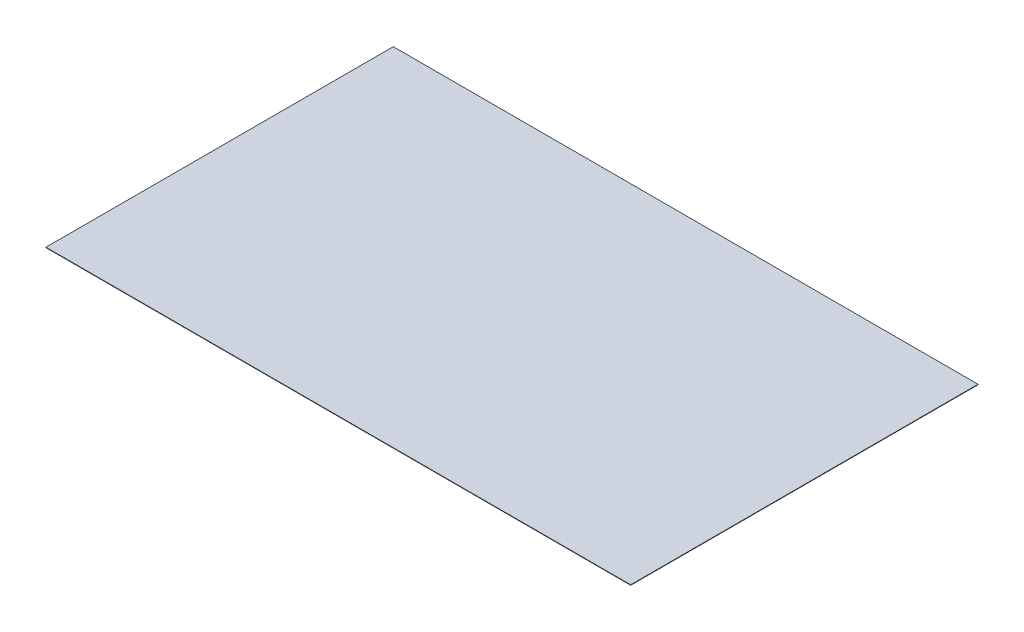
ISO-10303-21;
HEADER;
FILE_DESCRIPTION(('STEP AP214'),'2;1');
FILE_NAME('part.step','',(''),(''),'','','');
FILE_SCHEMA(('AUTOMOTIVE_DESIGN { 1 0 10303 214 1 1 1 1 }'));
ENDSEC;
DATA;
#1=APPLICATION_CONTEXT('core data for automotive mechanical design processes');
#2=APPLICATION_PROTOCOL_DEFINITION('international standard','automotive_design',2000,#1);
#3=PRODUCT_CONTEXT('',#1,'mechanical');
#4=PRODUCT('Part','Part','',(#3));
#5=PRODUCT_RELATED_PRODUCT_CATEGORY('part','',(#4));
#6=PRODUCT_DEFINITION_FORMATION('','',#4);
#7=PRODUCT_DEFINITION_CONTEXT('part definition',#1,'design');
#8=PRODUCT_DEFINITION('design','',#6,#7);
#9=PRODUCT_DEFINITION_SHAPE('','',#8);
#10=(LENGTH_UNIT() NAMED_UNIT(*) SI_UNIT(.MILLI.,.METRE.));
#11=(NAMED_UNIT(*) PLANE_ANGLE_UNIT() SI_UNIT($,.RADIAN.));
#12=(NAMED_UNIT(*) SI_UNIT($,.STERADIAN.) SOLID_ANGLE_UNIT());
#13=UNCERTAINTY_MEASURE_WITH_UNIT(LENGTH_MEASURE(1.E-05),#10,'distance_accuracy_value','');
#14=(GEOMETRIC_REPRESENTATION_CONTEXT(3) GLOBAL_UNCERTAINTY_ASSIGNED_CONTEXT((#13)) GLOBAL_UNIT_ASSIGNED_CONTEXT((#10,
#11,#12)) REPRESENTATION_CONTEXT('',''));
#15=CARTESIAN_POINT('',(0.,0.,0.));
#16=DIRECTION('',(0.,0.,1.));
#17=DIRECTION('',(1.,0.,0.));
#18=AXIS2_PLACEMENT_3D('',#15,#16,#17);
#19=CARTESIAN_POINT('',(61.5,1669.,-758.5));
#20=DIRECTION('',(-1.,0.,0.));
#21=DIRECTION('',(0.,0.,1.));
#22=AXIS2_PLACEMENT_3D('',#19,#20,#21);
#23=PLANE('',#22);
#24=DIRECTION('',(0.,-1.,0.));
#25=VECTOR('',#24,1.);
#26=CARTESIAN_POINT('',(61.5,1669.,0.));
#27=LINE('',#26,#25);
#28=CARTESIAN_POINT('',(61.5,1670.,0.));
#29=VERTEX_POINT('',#28);
#30=CARTESIAN_POINT('',(61.5,1669.,0.));
#31=VERTEX_POINT('',#30);
#32=EDGE_CURVE('E103',#29,#31,#27,.T.);
#33=ORIENTED_EDGE('',*,*,#32,.F.);
#34=DIRECTION('',(0.,0.,1.));
#35=VECTOR('',#34,1.);
#36=CARTESIAN_POINT('',(61.5,1670.,-758.5));
#37=LINE('',#36,#35);
#38=CARTESIAN_POINT('',(61.5,1670.,-758.5));
#39=VERTEX_POINT('',#38);
#40=EDGE_CURVE('E11',#39,#29,#37,.T.);
#41=ORIENTED_EDGE('',*,*,#40,.F.);
#42=DIRECTION('',(0.,-1.,0.));
#43=VECTOR('',#42,1.);
#44=CARTESIAN_POINT('',(61.5,1669.,-758.5));
#45=LINE('',#44,#43);
#46=CARTESIAN_POINT('',(61.5,1669.,-758.5));
#47=VERTEX_POINT('',#46);
#48=EDGE_CURVE('E97',#39,#47,#45,.T.);
#49=ORIENTED_EDGE('',*,*,#48,.T.);
#50=DIRECTION('',(0.,0.,1.));
#51=VECTOR('',#50,1.);
#52=CARTESIAN_POINT('',(61.5,1669.,-758.5));
#53=LINE('',#52,#51);
#54=EDGE_CURVE('E42',#47,#31,#53,.T.);
#55=ORIENTED_EDGE('',*,*,#54,.T.);
#56=EDGE_LOOP('',(#33,#41,#49,#55));
#57=FACE_BOUND('',#56,.T.);
#58=ADVANCED_FACE('F39',(#57),#23,.T.);
#59=CARTESIAN_POINT('',(61.5,1670.,-758.5));
#60=DIRECTION('',(0.,1.,0.));
#61=DIRECTION('',(0.,0.,1.));
#62=AXIS2_PLACEMENT_3D('',#59,#60,#61);
#63=PLANE('',#62);
#64=DIRECTION('',(-1.,0.,0.));
#65=VECTOR('',#64,1.);
#66=CARTESIAN_POINT('',(61.5,1670.,0.));
#67=LINE('',#66,#65);
#68=CARTESIAN_POINT('',(1338.5,1670.,0.));
#69=VERTEX_POINT('',#68);
#70=EDGE_CURVE('E99',#69,#29,#67,.T.);
#71=ORIENTED_EDGE('',*,*,#70,.F.);
#72=DIRECTION('',(0.,0.,1.));
#73=VECTOR('',#72,1.);
#74=CARTESIAN_POINT('',(1338.5,1670.,-758.5));
#75=LINE('',#74,#73);
#76=CARTESIAN_POINT('',(1338.5,1670.,-758.5));
#77=VERTEX_POINT('',#76);
#78=EDGE_CURVE('E48',#77,#69,#75,.T.);
#79=ORIENTED_EDGE('',*,*,#78,.F.);
#80=DIRECTION('',(-1.,0.,0.));
#81=VECTOR('',#80,1.);
#82=CARTESIAN_POINT('',(61.5,1670.,-758.5));
#83=LINE('',#82,#81);
#84=EDGE_CURVE('E94',#77,#39,#83,.T.);
#85=ORIENTED_EDGE('',*,*,#84,.T.);
#86=ORIENTED_EDGE('',*,*,#40,.T.);
#87=EDGE_LOOP('',(#71,#79,#85,#86));
#88=FACE_BOUND('',#87,.T.);
#89=ADVANCED_FACE('F113',(#88),#63,.T.);
#90=CARTESIAN_POINT('',(1338.5,1669.,-758.5));
#91=DIRECTION('',(1.,0.,0.));
#92=DIRECTION('',(0.,0.,-1.));
#93=AXIS2_PLACEMENT_3D('',#90,#91,#92);
#94=PLANE('',#93);
#95=DIRECTION('',(0.,1.,0.));
#96=VECTOR('',#95,1.);
#97=CARTESIAN_POINT('',(1338.5,1669.,0.));
#98=LINE('',#97,#96);
#99=CARTESIAN_POINT('',(1338.5,1669.,0.));
#100=VERTEX_POINT('',#99);
#101=EDGE_CURVE('E89',#100,#69,#98,.T.);
#102=ORIENTED_EDGE('',*,*,#101,.F.);
#103=DIRECTION('',(0.,0.,1.));
#104=VECTOR('',#103,1.);
#105=CARTESIAN_POINT('',(1338.5,1669.,-758.5));
#106=LINE('',#105,#104);
#107=CARTESIAN_POINT('',(1338.5,1669.,-758.5));
#108=VERTEX_POINT('',#107);
#109=EDGE_CURVE('E84',#108,#100,#106,.T.);
#110=ORIENTED_EDGE('',*,*,#109,.F.);
#111=DIRECTION('',(0.,1.,0.));
#112=VECTOR('',#111,1.);
#113=CARTESIAN_POINT('',(1338.5,1669.,-758.5));
#114=LINE('',#113,#112);
#115=EDGE_CURVE('E87',#108,#77,#114,.T.);
#116=ORIENTED_EDGE('',*,*,#115,.T.);
#117=ORIENTED_EDGE('',*,*,#78,.T.);
#118=EDGE_LOOP('',(#102,#110,#116,#117));
#119=FACE_BOUND('',#118,.T.);
#120=ADVANCED_FACE('F86',(#119),#94,.T.);
#121=CARTESIAN_POINT('',(61.5,1669.,-758.5));
#122=DIRECTION('',(0.,-1.,0.));
#123=DIRECTION('',(0.,0.,-1.));
#124=AXIS2_PLACEMENT_3D('',#121,#122,#123);
#125=PLANE('',#124);
#126=DIRECTION('',(1.,0.,0.));
#127=VECTOR('',#126,1.);
#128=CARTESIAN_POINT('',(61.5,1669.,0.));
#129=LINE('',#128,#127);
#130=EDGE_CURVE('E106',#31,#100,#129,.T.);
#131=ORIENTED_EDGE('',*,*,#130,.F.);
#132=ORIENTED_EDGE('',*,*,#54,.F.);
#133=DIRECTION('',(1.,0.,0.));
#134=VECTOR('',#133,1.);
#135=CARTESIAN_POINT('',(61.5,1669.,-758.5));
#136=LINE('',#135,#134);
#137=EDGE_CURVE('E93',#47,#108,#136,.T.);
#138=ORIENTED_EDGE('',*,*,#137,.T.);
#139=ORIENTED_EDGE('',*,*,#109,.T.);
#140=EDGE_LOOP('',(#131,#132,#138,#139));
#141=FACE_BOUND('',#140,.T.);
#142=ADVANCED_FACE('F96',(#141),#125,.T.);
#143=CARTESIAN_POINT('',(0.,0.,-758.5));
#144=DIRECTION('',(0.,0.,-1.));
#145=DIRECTION('',(-1.,0.,0.));
#146=AXIS2_PLACEMENT_3D('',#143,#144,#145);
#147=PLANE('',#146);
#148=ORIENTED_EDGE('',*,*,#48,.F.);
#149=ORIENTED_EDGE('',*,*,#84,.F.);
#150=ORIENTED_EDGE('',*,*,#115,.F.);
#151=ORIENTED_EDGE('',*,*,#137,.F.);
#152=EDGE_LOOP('',(#148,#149,#150,#151));
#153=FACE_BOUND('',#152,.T.);
#154=ADVANCED_FACE('F92',(#153),#147,.T.);
#155=CARTESIAN_POINT('',(0.,0.,0.));
#156=DIRECTION('',(0.,0.,-1.));
#157=DIRECTION('',(-1.,0.,0.));
#158=AXIS2_PLACEMENT_3D('',#155,#156,#157);
#159=PLANE('',#158);
#160=ORIENTED_EDGE('',*,*,#32,.T.);
#161=ORIENTED_EDGE('',*,*,#130,.T.);
#162=ORIENTED_EDGE('',*,*,#101,.T.);
#163=ORIENTED_EDGE('',*,*,#70,.T.);
#164=EDGE_LOOP('',(#160,#161,#162,#163));
#165=FACE_BOUND('',#164,.T.);
#166=ADVANCED_FACE('F112',(#165),#159,.F.);
#167=CLOSED_SHELL('',(#58,#89,#120,#142,#154,#166));
#168=MANIFOLD_SOLID_BREP('B2',#167);
#169=ADVANCED_BREP_SHAPE_REPRESENTATION('',(#18,#168),#14);
#170=SHAPE_DEFINITION_REPRESENTATION(#9,#169);
ENDSEC;
END-ISO-10303-21;
